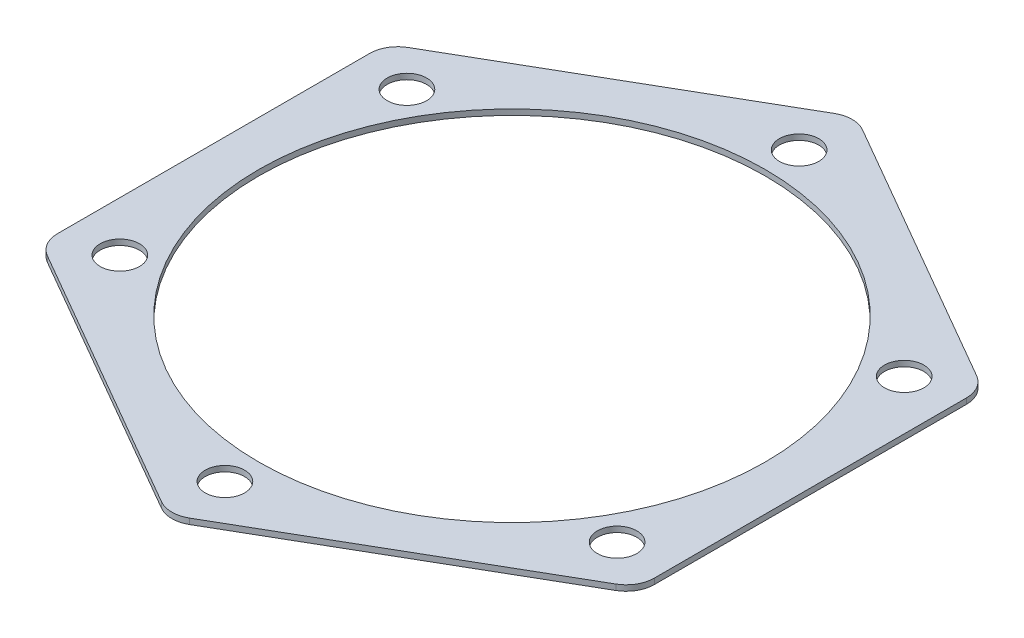
ISO-10303-21;
HEADER;
FILE_DESCRIPTION(('STEP AP214'),'2;1');
FILE_NAME('part.step','',(''),(''),'','','');
FILE_SCHEMA(('AUTOMOTIVE_DESIGN { 1 0 10303 214 1 1 1 1 }'));
ENDSEC;
DATA;
#1=APPLICATION_CONTEXT('core data for automotive mechanical design processes');
#2=APPLICATION_PROTOCOL_DEFINITION('international standard','automotive_design',2000,#1);
#3=PRODUCT_CONTEXT('',#1,'mechanical');
#4=PRODUCT('Part','Part','',(#3));
#5=PRODUCT_RELATED_PRODUCT_CATEGORY('part','',(#4));
#6=PRODUCT_DEFINITION_FORMATION('','',#4);
#7=PRODUCT_DEFINITION_CONTEXT('part definition',#1,'design');
#8=PRODUCT_DEFINITION('design','',#6,#7);
#9=PRODUCT_DEFINITION_SHAPE('','',#8);
#10=(LENGTH_UNIT() NAMED_UNIT(*) SI_UNIT(.MILLI.,.METRE.));
#11=(NAMED_UNIT(*) PLANE_ANGLE_UNIT() SI_UNIT($,.RADIAN.));
#12=(NAMED_UNIT(*) SI_UNIT($,.STERADIAN.) SOLID_ANGLE_UNIT());
#13=UNCERTAINTY_MEASURE_WITH_UNIT(LENGTH_MEASURE(1.E-05),#10,'distance_accuracy_value','');
#14=(GEOMETRIC_REPRESENTATION_CONTEXT(3) GLOBAL_UNCERTAINTY_ASSIGNED_CONTEXT((#13)) GLOBAL_UNIT_ASSIGNED_CONTEXT((#10,
#11,#12)) REPRESENTATION_CONTEXT('',''));
#15=CARTESIAN_POINT('',(0.,0.,0.));
#16=DIRECTION('',(0.,0.,1.));
#17=DIRECTION('',(1.,0.,0.));
#18=AXIS2_PLACEMENT_3D('',#15,#16,#17);
#19=CARTESIAN_POINT('',(-48.,1.,-27.712812921102));
#20=DIRECTION('',(0.,1.,0.));
#21=DIRECTION('',(0.,0.,1.));
#22=AXIS2_PLACEMENT_3D('',#19,#20,#21);
#23=PLANE('',#22);
#24=CARTESIAN_POINT('',(-44.1672955930031,1.,25.5000000000019));
#25=DIRECTION('',(0.,1.,0.));
#26=DIRECTION('',(0.,0.,1.));
#27=AXIS2_PLACEMENT_3D('',#24,#25,#26);
#28=CIRCLE('',#27,3.50000000000413);
#29=CARTESIAN_POINT('',(-44.1672955930031,1.,29.000000000006));
#30=VERTEX_POINT('',#29);
#31=EDGE_CURVE('E313',#30,#30,#28,.T.);
#32=ORIENTED_EDGE('',*,*,#31,.F.);
#33=EDGE_LOOP('',(#32));
#34=FACE_BOUND('',#33,.T.);
#35=CARTESIAN_POINT('',(44.1672955930096,1.,25.4999999999981));
#36=DIRECTION('',(0.,1.,0.));
#37=DIRECTION('',(0.,0.,1.));
#38=AXIS2_PLACEMENT_3D('',#35,#36,#37);
#39=CIRCLE('',#38,3.50000000000279);
#40=CARTESIAN_POINT('',(44.1672955930096,1.,29.0000000000009));
#41=VERTEX_POINT('',#40);
#42=EDGE_CURVE('E325',#41,#41,#39,.T.);
#43=ORIENTED_EDGE('',*,*,#42,.F.);
#44=EDGE_LOOP('',(#43));
#45=FACE_BOUND('',#44,.T.);
#46=CARTESIAN_POINT('',(0.,1.,-51.));
#47=DIRECTION('',(0.,1.,0.));
#48=DIRECTION('',(0.,0.,1.));
#49=AXIS2_PLACEMENT_3D('',#46,#47,#48);
#50=CIRCLE('',#49,3.5);
#51=CARTESIAN_POINT('',(0.,1.,-47.5));
#52=VERTEX_POINT('',#51);
#53=EDGE_CURVE('E337',#52,#52,#50,.T.);
#54=ORIENTED_EDGE('',*,*,#53,.F.);
#55=EDGE_LOOP('',(#54));
#56=FACE_BOUND('',#55,.T.);
#57=CARTESIAN_POINT('',(-48.,1.,-27.712812921102));
#58=DIRECTION('',(0.,1.,0.));
#59=DIRECTION('',(0.,0.,1.));
#60=AXIS2_PLACEMENT_3D('',#57,#58,#59);
#61=CIRCLE('',#60,5.);
#62=CARTESIAN_POINT('',(-50.5,1.,-32.0429399400242));
#63=VERTEX_POINT('',#62);
#64=CARTESIAN_POINT('',(-53.,1.,-27.712812921102));
#65=VERTEX_POINT('',#64);
#66=EDGE_CURVE('E187',#63,#65,#61,.T.);
#67=ORIENTED_EDGE('',*,*,#66,.T.);
#68=DIRECTION('',(0.,0.,1.));
#69=VECTOR('',#68,1.);
#70=CARTESIAN_POINT('',(-53.,1.,-27.712812921102));
#71=LINE('',#70,#69);
#72=CARTESIAN_POINT('',(-53.,1.,27.712812921102));
#73=VERTEX_POINT('',#72);
#74=EDGE_CURVE('E115',#65,#73,#71,.T.);
#75=ORIENTED_EDGE('',*,*,#74,.T.);
#76=CARTESIAN_POINT('',(-48.,1.,27.712812921102));
#77=DIRECTION('',(0.,1.,0.));
#78=DIRECTION('',(0.,0.,-1.));
#79=AXIS2_PLACEMENT_3D('',#76,#77,#78);
#80=CIRCLE('',#79,5.);
#81=CARTESIAN_POINT('',(-50.5,1.,32.0429399400242));
#82=VERTEX_POINT('',#81);
#83=EDGE_CURVE('E214',#73,#82,#80,.T.);
#84=ORIENTED_EDGE('',*,*,#83,.T.);
#85=DIRECTION('',(0.866025403784438,0.,0.5));
#86=VECTOR('',#85,1.);
#87=CARTESIAN_POINT('',(-50.5,1.,32.0429399400242));
#88=LINE('',#87,#86);
#89=CARTESIAN_POINT('',(-2.50000000000004,1.,59.7557528611262));
#90=VERTEX_POINT('',#89);
#91=EDGE_CURVE('E233',#82,#90,#88,.T.);
#92=ORIENTED_EDGE('',*,*,#91,.T.);
#93=CARTESIAN_POINT('',(0.,1.,55.4256258422041));
#94=DIRECTION('',(0.,1.,0.));
#95=DIRECTION('',(0.,0.,1.));
#96=AXIS2_PLACEMENT_3D('',#93,#94,#95);
#97=CIRCLE('',#96,5.);
#98=CARTESIAN_POINT('',(2.5,1.,59.7557528611262));
#99=VERTEX_POINT('',#98);
#100=EDGE_CURVE('E230',#90,#99,#97,.T.);
#101=ORIENTED_EDGE('',*,*,#100,.T.);
#102=DIRECTION('',(0.866025403784439,0.,-0.5));
#103=VECTOR('',#102,1.);
#104=CARTESIAN_POINT('',(2.5,1.,59.7557528611262));
#105=LINE('',#104,#103);
#106=CARTESIAN_POINT('',(50.5,1.,32.0429399400242));
#107=VERTEX_POINT('',#106);
#108=EDGE_CURVE('E232',#99,#107,#105,.T.);
#109=ORIENTED_EDGE('',*,*,#108,.T.);
#110=CARTESIAN_POINT('',(48.,1.,27.712812921102));
#111=DIRECTION('',(0.,1.,0.));
#112=DIRECTION('',(0.,0.,1.));
#113=AXIS2_PLACEMENT_3D('',#110,#111,#112);
#114=CIRCLE('',#113,5.);
#115=CARTESIAN_POINT('',(53.,1.,27.712812921102));
#116=VERTEX_POINT('',#115);
#117=EDGE_CURVE('E235',#107,#116,#114,.T.);
#118=ORIENTED_EDGE('',*,*,#117,.T.);
#119=DIRECTION('',(0.,0.,-1.));
#120=VECTOR('',#119,1.);
#121=CARTESIAN_POINT('',(53.,1.,27.712812921102));
#122=LINE('',#121,#120);
#123=CARTESIAN_POINT('',(53.,1.,-27.712812921102));
#124=VERTEX_POINT('',#123);
#125=EDGE_CURVE('E241',#116,#124,#122,.T.);
#126=ORIENTED_EDGE('',*,*,#125,.T.);
#127=CARTESIAN_POINT('',(48.,1.,-27.7128129211021));
#128=DIRECTION('',(0.,1.,0.));
#129=DIRECTION('',(0.,0.,1.));
#130=AXIS2_PLACEMENT_3D('',#127,#128,#129);
#131=CIRCLE('',#130,5.);
#132=CARTESIAN_POINT('',(50.5,1.,-32.0429399400243));
#133=VERTEX_POINT('',#132);
#134=EDGE_CURVE('E146',#124,#133,#131,.T.);
#135=ORIENTED_EDGE('',*,*,#134,.T.);
#136=DIRECTION('',(-0.866025403784439,0.,-0.5));
#137=VECTOR('',#136,1.);
#138=CARTESIAN_POINT('',(50.5,1.,-32.0429399400243));
#139=LINE('',#138,#137);
#140=CARTESIAN_POINT('',(2.50000000000002,1.,-59.7557528611263));
#141=VERTEX_POINT('',#140);
#142=EDGE_CURVE('E140',#133,#141,#139,.T.);
#143=ORIENTED_EDGE('',*,*,#142,.T.);
#144=CARTESIAN_POINT('',(0.,1.,-55.4256258422041));
#145=DIRECTION('',(0.,1.,0.));
#146=DIRECTION('',(0.,0.,1.));
#147=AXIS2_PLACEMENT_3D('',#144,#145,#146);
#148=CIRCLE('',#147,5.);
#149=CARTESIAN_POINT('',(-2.50000000000002,1.,-59.7557528611263));
#150=VERTEX_POINT('',#149);
#151=EDGE_CURVE('E144',#141,#150,#148,.T.);
#152=ORIENTED_EDGE('',*,*,#151,.T.);
#153=DIRECTION('',(-0.866025403784439,0.,0.5));
#154=VECTOR('',#153,1.);
#155=CARTESIAN_POINT('',(-2.50000000000002,1.,-59.7557528611263));
#156=LINE('',#155,#154);
#157=EDGE_CURVE('E60',#150,#63,#156,.T.);
#158=ORIENTED_EDGE('',*,*,#157,.T.);
#159=EDGE_LOOP('',(#67,#75,#84,#92,#101,#109,#118,#126,#135,#143,#152,#158));
#160=FACE_BOUND('',#159,.T.);
#161=CARTESIAN_POINT('',(0.,1.,0.));
#162=DIRECTION('',(0.,1.,0.));
#163=DIRECTION('',(0.,0.,1.));
#164=AXIS2_PLACEMENT_3D('',#161,#162,#163);
#165=CIRCLE('',#164,45.);
#166=CARTESIAN_POINT('',(0.,1.,45.));
#167=VERTEX_POINT('',#166);
#168=EDGE_CURVE('E168',#167,#167,#165,.T.);
#169=ORIENTED_EDGE('',*,*,#168,.F.);
#170=EDGE_LOOP('',(#169));
#171=FACE_BOUND('',#170,.T.);
#172=CARTESIAN_POINT('',(44.1672955930074,1.,-25.5000000000019));
#173=DIRECTION('',(0.,1.,0.));
#174=DIRECTION('',(0.,0.,1.));
#175=AXIS2_PLACEMENT_3D('',#172,#173,#174);
#176=CIRCLE('',#175,3.50000000000063);
#177=CARTESIAN_POINT('',(44.1672955930074,1.,-22.0000000000013));
#178=VERTEX_POINT('',#177);
#179=EDGE_CURVE('E331',#178,#178,#176,.T.);
#180=ORIENTED_EDGE('',*,*,#179,.F.);
#181=EDGE_LOOP('',(#180));
#182=FACE_BOUND('',#181,.T.);
#183=CARTESIAN_POINT('',(4.32978444682486E-12,1.,51.));
#184=DIRECTION('',(0.,1.,0.));
#185=DIRECTION('',(0.,0.,1.));
#186=AXIS2_PLACEMENT_3D('',#183,#184,#185);
#187=CIRCLE('',#186,3.50000000000448);
#188=CARTESIAN_POINT('',(4.32978444682486E-12,1.,54.5000000000045));
#189=VERTEX_POINT('',#188);
#190=EDGE_CURVE('E319',#189,#189,#187,.T.);
#191=ORIENTED_EDGE('',*,*,#190,.F.);
#192=EDGE_LOOP('',(#191));
#193=FACE_BOUND('',#192,.T.);
#194=CARTESIAN_POINT('',(-44.1672955930053,1.,-25.4999999999981));
#195=DIRECTION('',(0.,1.,0.));
#196=DIRECTION('',(0.,0.,1.));
#197=AXIS2_PLACEMENT_3D('',#194,#195,#196);
#198=CIRCLE('',#197,3.50000000000219);
#199=CARTESIAN_POINT('',(-44.1672955930053,1.,-21.9999999999959));
#200=VERTEX_POINT('',#199);
#201=EDGE_CURVE('E304',#200,#200,#198,.T.);
#202=ORIENTED_EDGE('',*,*,#201,.F.);
#203=EDGE_LOOP('',(#202));
#204=FACE_BOUND('',#203,.T.);
#205=ADVANCED_FACE('F43',(#34,#45,#56,#160,#171,#182,#193,#204),#23,.T.);
#206=CARTESIAN_POINT('',(-48.,0.,-27.712812921102));
#207=DIRECTION('',(0.,1.,0.));
#208=DIRECTION('',(0.,0.,1.));
#209=AXIS2_PLACEMENT_3D('',#206,#207,#208);
#210=PLANE('',#209);
#211=CARTESIAN_POINT('',(-48.,0.,-27.712812921102));
#212=DIRECTION('',(0.,1.,0.));
#213=DIRECTION('',(0.,0.,1.));
#214=AXIS2_PLACEMENT_3D('',#211,#212,#213);
#215=CIRCLE('',#214,5.);
#216=CARTESIAN_POINT('',(-50.5,0.,-32.0429399400242));
#217=VERTEX_POINT('',#216);
#218=CARTESIAN_POINT('',(-53.,0.,-27.712812921102));
#219=VERTEX_POINT('',#218);
#220=EDGE_CURVE('E164',#217,#219,#215,.T.);
#221=ORIENTED_EDGE('',*,*,#220,.F.);
#222=DIRECTION('',(-0.866025403784439,0.,0.5));
#223=VECTOR('',#222,1.);
#224=CARTESIAN_POINT('',(-2.50000000000002,0.,-59.7557528611263));
#225=LINE('',#224,#223);
#226=CARTESIAN_POINT('',(-2.50000000000002,0.,-59.7557528611263));
#227=VERTEX_POINT('',#226);
#228=EDGE_CURVE('E107',#227,#217,#225,.T.);
#229=ORIENTED_EDGE('',*,*,#228,.F.);
#230=CARTESIAN_POINT('',(0.,0.,-55.4256258422041));
#231=DIRECTION('',(0.,1.,0.));
#232=DIRECTION('',(0.,0.,1.));
#233=AXIS2_PLACEMENT_3D('',#230,#231,#232);
#234=CIRCLE('',#233,5.);
#235=CARTESIAN_POINT('',(2.50000000000002,0.,-59.7557528611263));
#236=VERTEX_POINT('',#235);
#237=EDGE_CURVE('E101',#236,#227,#234,.T.);
#238=ORIENTED_EDGE('',*,*,#237,.F.);
#239=DIRECTION('',(-0.866025403784439,0.,-0.5));
#240=VECTOR('',#239,1.);
#241=CARTESIAN_POINT('',(50.5,0.,-32.0429399400243));
#242=LINE('',#241,#240);
#243=CARTESIAN_POINT('',(50.5,0.,-32.0429399400243));
#244=VERTEX_POINT('',#243);
#245=EDGE_CURVE('E154',#244,#236,#242,.T.);
#246=ORIENTED_EDGE('',*,*,#245,.F.);
#247=CARTESIAN_POINT('',(48.,0.,-27.7128129211021));
#248=DIRECTION('',(0.,1.,0.));
#249=DIRECTION('',(0.,0.,1.));
#250=AXIS2_PLACEMENT_3D('',#247,#248,#249);
#251=CIRCLE('',#250,5.);
#252=CARTESIAN_POINT('',(53.,0.,-27.712812921102));
#253=VERTEX_POINT('',#252);
#254=EDGE_CURVE('E182',#253,#244,#251,.T.);
#255=ORIENTED_EDGE('',*,*,#254,.F.);
#256=DIRECTION('',(0.,0.,-1.));
#257=VECTOR('',#256,1.);
#258=CARTESIAN_POINT('',(53.,0.,27.712812921102));
#259=LINE('',#258,#257);
#260=CARTESIAN_POINT('',(53.,0.,27.712812921102));
#261=VERTEX_POINT('',#260);
#262=EDGE_CURVE('E180',#261,#253,#259,.T.);
#263=ORIENTED_EDGE('',*,*,#262,.F.);
#264=CARTESIAN_POINT('',(48.,0.,27.712812921102));
#265=DIRECTION('',(0.,1.,0.));
#266=DIRECTION('',(0.,0.,1.));
#267=AXIS2_PLACEMENT_3D('',#264,#265,#266);
#268=CIRCLE('',#267,5.);
#269=CARTESIAN_POINT('',(50.5,0.,32.0429399400242));
#270=VERTEX_POINT('',#269);
#271=EDGE_CURVE('E178',#270,#261,#268,.T.);
#272=ORIENTED_EDGE('',*,*,#271,.F.);
#273=DIRECTION('',(0.866025403784439,0.,-0.5));
#274=VECTOR('',#273,1.);
#275=CARTESIAN_POINT('',(2.5,0.,59.7557528611262));
#276=LINE('',#275,#274);
#277=CARTESIAN_POINT('',(2.5,0.,59.7557528611262));
#278=VERTEX_POINT('',#277);
#279=EDGE_CURVE('E176',#278,#270,#276,.T.);
#280=ORIENTED_EDGE('',*,*,#279,.F.);
#281=CARTESIAN_POINT('',(0.,0.,55.4256258422041));
#282=DIRECTION('',(0.,1.,0.));
#283=DIRECTION('',(0.,0.,1.));
#284=AXIS2_PLACEMENT_3D('',#281,#282,#283);
#285=CIRCLE('',#284,5.);
#286=CARTESIAN_POINT('',(-2.50000000000004,0.,59.7557528611262));
#287=VERTEX_POINT('',#286);
#288=EDGE_CURVE('E174',#287,#278,#285,.T.);
#289=ORIENTED_EDGE('',*,*,#288,.F.);
#290=DIRECTION('',(0.866025403784438,0.,0.5));
#291=VECTOR('',#290,1.);
#292=CARTESIAN_POINT('',(-50.5,0.,32.0429399400242));
#293=LINE('',#292,#291);
#294=CARTESIAN_POINT('',(-50.5,0.,32.0429399400242));
#295=VERTEX_POINT('',#294);
#296=EDGE_CURVE('E172',#295,#287,#293,.T.);
#297=ORIENTED_EDGE('',*,*,#296,.F.);
#298=CARTESIAN_POINT('',(-48.,0.,27.712812921102));
#299=DIRECTION('',(0.,1.,0.));
#300=DIRECTION('',(0.,0.,-1.));
#301=AXIS2_PLACEMENT_3D('',#298,#299,#300);
#302=CIRCLE('',#301,5.);
#303=CARTESIAN_POINT('',(-53.,0.,27.712812921102));
#304=VERTEX_POINT('',#303);
#305=EDGE_CURVE('E170',#304,#295,#302,.T.);
#306=ORIENTED_EDGE('',*,*,#305,.F.);
#307=DIRECTION('',(0.,0.,1.));
#308=VECTOR('',#307,1.);
#309=CARTESIAN_POINT('',(-53.,0.,-27.712812921102));
#310=LINE('',#309,#308);
#311=EDGE_CURVE('E167',#219,#304,#310,.T.);
#312=ORIENTED_EDGE('',*,*,#311,.F.);
#313=EDGE_LOOP('',(#221,#229,#238,#246,#255,#263,#272,#280,#289,#297,#306,#312));
#314=FACE_BOUND('',#313,.T.);
#315=CARTESIAN_POINT('',(0.,0.,0.));
#316=DIRECTION('',(0.,1.,0.));
#317=DIRECTION('',(0.,0.,1.));
#318=AXIS2_PLACEMENT_3D('',#315,#316,#317);
#319=CIRCLE('',#318,45.);
#320=CARTESIAN_POINT('',(0.,0.,45.));
#321=VERTEX_POINT('',#320);
#322=EDGE_CURVE('E340',#321,#321,#319,.T.);
#323=ORIENTED_EDGE('',*,*,#322,.T.);
#324=EDGE_LOOP('',(#323));
#325=FACE_BOUND('',#324,.T.);
#326=CARTESIAN_POINT('',(0.,0.,-51.));
#327=DIRECTION('',(0.,1.,0.));
#328=DIRECTION('',(0.,0.,1.));
#329=AXIS2_PLACEMENT_3D('',#326,#327,#328);
#330=CIRCLE('',#329,3.5);
#331=CARTESIAN_POINT('',(0.,0.,-47.5));
#332=VERTEX_POINT('',#331);
#333=EDGE_CURVE('E334',#332,#332,#330,.T.);
#334=ORIENTED_EDGE('',*,*,#333,.T.);
#335=EDGE_LOOP('',(#334));
#336=FACE_BOUND('',#335,.T.);
#337=CARTESIAN_POINT('',(44.1672955930074,0.,-25.5000000000019));
#338=DIRECTION('',(0.,1.,0.));
#339=DIRECTION('',(0.,0.,1.));
#340=AXIS2_PLACEMENT_3D('',#337,#338,#339);
#341=CIRCLE('',#340,3.50000000000063);
#342=CARTESIAN_POINT('',(44.1672955930074,0.,-22.0000000000013));
#343=VERTEX_POINT('',#342);
#344=EDGE_CURVE('E328',#343,#343,#341,.T.);
#345=ORIENTED_EDGE('',*,*,#344,.T.);
#346=EDGE_LOOP('',(#345));
#347=FACE_BOUND('',#346,.T.);
#348=CARTESIAN_POINT('',(44.1672955930096,0.,25.4999999999981));
#349=DIRECTION('',(0.,1.,0.));
#350=DIRECTION('',(0.,0.,1.));
#351=AXIS2_PLACEMENT_3D('',#348,#349,#350);
#352=CIRCLE('',#351,3.50000000000279);
#353=CARTESIAN_POINT('',(44.1672955930096,0.,29.0000000000009));
#354=VERTEX_POINT('',#353);
#355=EDGE_CURVE('E322',#354,#354,#352,.T.);
#356=ORIENTED_EDGE('',*,*,#355,.T.);
#357=EDGE_LOOP('',(#356));
#358=FACE_BOUND('',#357,.T.);
#359=CARTESIAN_POINT('',(4.32978444682486E-12,0.,51.));
#360=DIRECTION('',(0.,1.,0.));
#361=DIRECTION('',(0.,0.,1.));
#362=AXIS2_PLACEMENT_3D('',#359,#360,#361);
#363=CIRCLE('',#362,3.50000000000448);
#364=CARTESIAN_POINT('',(4.32978444682486E-12,0.,54.5000000000045));
#365=VERTEX_POINT('',#364);
#366=EDGE_CURVE('E316',#365,#365,#363,.T.);
#367=ORIENTED_EDGE('',*,*,#366,.T.);
#368=EDGE_LOOP('',(#367));
#369=FACE_BOUND('',#368,.T.);
#370=CARTESIAN_POINT('',(-44.1672955930031,0.,25.5000000000019));
#371=DIRECTION('',(0.,1.,0.));
#372=DIRECTION('',(0.,0.,1.));
#373=AXIS2_PLACEMENT_3D('',#370,#371,#372);
#374=CIRCLE('',#373,3.50000000000413);
#375=CARTESIAN_POINT('',(-44.1672955930031,0.,29.000000000006));
#376=VERTEX_POINT('',#375);
#377=EDGE_CURVE('E310',#376,#376,#374,.T.);
#378=ORIENTED_EDGE('',*,*,#377,.T.);
#379=EDGE_LOOP('',(#378));
#380=FACE_BOUND('',#379,.T.);
#381=CARTESIAN_POINT('',(-44.1672955930053,0.,-25.4999999999981));
#382=DIRECTION('',(0.,1.,0.));
#383=DIRECTION('',(0.,0.,1.));
#384=AXIS2_PLACEMENT_3D('',#381,#382,#383);
#385=CIRCLE('',#384,3.50000000000219);
#386=CARTESIAN_POINT('',(-44.1672955930053,0.,-21.9999999999959));
#387=VERTEX_POINT('',#386);
#388=EDGE_CURVE('E307',#387,#387,#385,.T.);
#389=ORIENTED_EDGE('',*,*,#388,.T.);
#390=EDGE_LOOP('',(#389));
#391=FACE_BOUND('',#390,.T.);
#392=ADVANCED_FACE('F218',(#314,#325,#336,#347,#358,#369,#380,#391),#210,.F.);
#393=CARTESIAN_POINT('',(-48.,1.,-27.712812921102));
#394=DIRECTION('',(0.,-1.,0.));
#395=DIRECTION('',(0.,0.,-1.));
#396=AXIS2_PLACEMENT_3D('',#393,#394,#395);
#397=CYLINDRICAL_SURFACE('',#396,5.);
#398=ORIENTED_EDGE('',*,*,#220,.T.);
#399=DIRECTION('',(0.,-1.,0.));
#400=VECTOR('',#399,1.);
#401=CARTESIAN_POINT('',(-53.,1.,-27.712812921102));
#402=LINE('',#401,#400);
#403=EDGE_CURVE('E11',#65,#219,#402,.T.);
#404=ORIENTED_EDGE('',*,*,#403,.F.);
#405=ORIENTED_EDGE('',*,*,#66,.F.);
#406=DIRECTION('',(0.,-1.,0.));
#407=VECTOR('',#406,1.);
#408=CARTESIAN_POINT('',(-50.5,1.,-32.0429399400242));
#409=LINE('',#408,#407);
#410=EDGE_CURVE('E160',#63,#217,#409,.T.);
#411=ORIENTED_EDGE('',*,*,#410,.T.);
#412=EDGE_LOOP('',(#398,#404,#405,#411));
#413=FACE_BOUND('',#412,.T.);
#414=ADVANCED_FACE('F45',(#413),#397,.T.);
#415=CARTESIAN_POINT('',(-53.,1.,-27.712812921102));
#416=DIRECTION('',(1.,0.,0.));
#417=DIRECTION('',(0.,0.,-1.));
#418=AXIS2_PLACEMENT_3D('',#415,#416,#417);
#419=PLANE('',#418);
#420=ORIENTED_EDGE('',*,*,#311,.T.);
#421=DIRECTION('',(0.,-1.,0.));
#422=VECTOR('',#421,1.);
#423=CARTESIAN_POINT('',(-53.,1.,27.712812921102));
#424=LINE('',#423,#422);
#425=EDGE_CURVE('E52',#73,#304,#424,.T.);
#426=ORIENTED_EDGE('',*,*,#425,.F.);
#427=ORIENTED_EDGE('',*,*,#74,.F.);
#428=ORIENTED_EDGE('',*,*,#403,.T.);
#429=EDGE_LOOP('',(#420,#426,#427,#428));
#430=FACE_BOUND('',#429,.T.);
#431=ADVANCED_FACE('F484',(#430),#419,.F.);
#432=CARTESIAN_POINT('',(-48.,1.,27.712812921102));
#433=DIRECTION('',(0.,-1.,0.));
#434=DIRECTION('',(0.,0.,-1.));
#435=AXIS2_PLACEMENT_3D('',#432,#433,#434);
#436=CYLINDRICAL_SURFACE('',#435,5.);
#437=ORIENTED_EDGE('',*,*,#305,.T.);
#438=DIRECTION('',(0.,-1.,0.));
#439=VECTOR('',#438,1.);
#440=CARTESIAN_POINT('',(-50.5,1.,32.0429399400242));
#441=LINE('',#440,#439);
#442=EDGE_CURVE('E206',#82,#295,#441,.T.);
#443=ORIENTED_EDGE('',*,*,#442,.F.);
#444=ORIENTED_EDGE('',*,*,#83,.F.);
#445=ORIENTED_EDGE('',*,*,#425,.T.);
#446=EDGE_LOOP('',(#437,#443,#444,#445));
#447=FACE_BOUND('',#446,.T.);
#448=ADVANCED_FACE('F212',(#447),#436,.T.);
#449=CARTESIAN_POINT('',(-50.5,1.,32.0429399400242));
#450=DIRECTION('',(0.5,0.,-0.866025403784439));
#451=DIRECTION('',(-0.866025403784439,0.,-0.5));
#452=AXIS2_PLACEMENT_3D('',#449,#450,#451);
#453=PLANE('',#452);
#454=ORIENTED_EDGE('',*,*,#296,.T.);
#455=DIRECTION('',(0.,-1.,0.));
#456=VECTOR('',#455,1.);
#457=CARTESIAN_POINT('',(-2.50000000000004,1.,59.7557528611262));
#458=LINE('',#457,#456);
#459=EDGE_CURVE('E203',#90,#287,#458,.T.);
#460=ORIENTED_EDGE('',*,*,#459,.F.);
#461=ORIENTED_EDGE('',*,*,#91,.F.);
#462=ORIENTED_EDGE('',*,*,#442,.T.);
#463=EDGE_LOOP('',(#454,#460,#461,#462));
#464=FACE_BOUND('',#463,.T.);
#465=ADVANCED_FACE('F224',(#464),#453,.F.);
#466=CARTESIAN_POINT('',(0.,1.,55.4256258422041));
#467=DIRECTION('',(0.,-1.,0.));
#468=DIRECTION('',(0.,0.,-1.));
#469=AXIS2_PLACEMENT_3D('',#466,#467,#468);
#470=CYLINDRICAL_SURFACE('',#469,5.);
#471=ORIENTED_EDGE('',*,*,#288,.T.);
#472=DIRECTION('',(0.,-1.,0.));
#473=VECTOR('',#472,1.);
#474=CARTESIAN_POINT('',(2.5,1.,59.7557528611262));
#475=LINE('',#474,#473);
#476=EDGE_CURVE('E200',#99,#278,#475,.T.);
#477=ORIENTED_EDGE('',*,*,#476,.F.);
#478=ORIENTED_EDGE('',*,*,#100,.F.);
#479=ORIENTED_EDGE('',*,*,#459,.T.);
#480=EDGE_LOOP('',(#471,#477,#478,#479));
#481=FACE_BOUND('',#480,.T.);
#482=ADVANCED_FACE('F228',(#481),#470,.T.);
#483=CARTESIAN_POINT('',(2.5,1.,59.7557528611262));
#484=DIRECTION('',(-0.5,0.,-0.866025403784439));
#485=DIRECTION('',(-0.866025403784439,0.,0.5));
#486=AXIS2_PLACEMENT_3D('',#483,#484,#485);
#487=PLANE('',#486);
#488=ORIENTED_EDGE('',*,*,#279,.T.);
#489=DIRECTION('',(0.,-1.,0.));
#490=VECTOR('',#489,1.);
#491=CARTESIAN_POINT('',(50.5,1.,32.0429399400242));
#492=LINE('',#491,#490);
#493=EDGE_CURVE('E197',#107,#270,#492,.T.);
#494=ORIENTED_EDGE('',*,*,#493,.F.);
#495=ORIENTED_EDGE('',*,*,#108,.F.);
#496=ORIENTED_EDGE('',*,*,#476,.T.);
#497=EDGE_LOOP('',(#488,#494,#495,#496));
#498=FACE_BOUND('',#497,.T.);
#499=ADVANCED_FACE('F449',(#498),#487,.F.);
#500=CARTESIAN_POINT('',(48.,1.,27.712812921102));
#501=DIRECTION('',(0.,-1.,0.));
#502=DIRECTION('',(0.,0.,-1.));
#503=AXIS2_PLACEMENT_3D('',#500,#501,#502);
#504=CYLINDRICAL_SURFACE('',#503,5.);
#505=ORIENTED_EDGE('',*,*,#271,.T.);
#506=DIRECTION('',(0.,-1.,0.));
#507=VECTOR('',#506,1.);
#508=CARTESIAN_POINT('',(53.,1.,27.712812921102));
#509=LINE('',#508,#507);
#510=EDGE_CURVE('E194',#116,#261,#509,.T.);
#511=ORIENTED_EDGE('',*,*,#510,.F.);
#512=ORIENTED_EDGE('',*,*,#117,.F.);
#513=ORIENTED_EDGE('',*,*,#493,.T.);
#514=EDGE_LOOP('',(#505,#511,#512,#513));
#515=FACE_BOUND('',#514,.T.);
#516=ADVANCED_FACE('F440',(#515),#504,.T.);
#517=CARTESIAN_POINT('',(53.,1.,27.712812921102));
#518=DIRECTION('',(-1.,0.,0.));
#519=DIRECTION('',(0.,0.,1.));
#520=AXIS2_PLACEMENT_3D('',#517,#518,#519);
#521=PLANE('',#520);
#522=ORIENTED_EDGE('',*,*,#262,.T.);
#523=DIRECTION('',(0.,-1.,0.));
#524=VECTOR('',#523,1.);
#525=CARTESIAN_POINT('',(53.,1.,-27.712812921102));
#526=LINE('',#525,#524);
#527=EDGE_CURVE('E191',#124,#253,#526,.T.);
#528=ORIENTED_EDGE('',*,*,#527,.F.);
#529=ORIENTED_EDGE('',*,*,#125,.F.);
#530=ORIENTED_EDGE('',*,*,#510,.T.);
#531=EDGE_LOOP('',(#522,#528,#529,#530));
#532=FACE_BOUND('',#531,.T.);
#533=ADVANCED_FACE('F247',(#532),#521,.F.);
#534=CARTESIAN_POINT('',(48.,1.,-27.7128129211021));
#535=DIRECTION('',(0.,-1.,0.));
#536=DIRECTION('',(0.,0.,-1.));
#537=AXIS2_PLACEMENT_3D('',#534,#535,#536);
#538=CYLINDRICAL_SURFACE('',#537,5.);
#539=ORIENTED_EDGE('',*,*,#254,.T.);
#540=DIRECTION('',(0.,-1.,0.));
#541=VECTOR('',#540,1.);
#542=CARTESIAN_POINT('',(50.5,1.,-32.0429399400243));
#543=LINE('',#542,#541);
#544=EDGE_CURVE('E155',#133,#244,#543,.T.);
#545=ORIENTED_EDGE('',*,*,#544,.F.);
#546=ORIENTED_EDGE('',*,*,#134,.F.);
#547=ORIENTED_EDGE('',*,*,#527,.T.);
#548=EDGE_LOOP('',(#539,#545,#546,#547));
#549=FACE_BOUND('',#548,.T.);
#550=ADVANCED_FACE('F251',(#549),#538,.T.);
#551=CARTESIAN_POINT('',(50.5,1.,-32.0429399400243));
#552=DIRECTION('',(-0.5,0.,0.866025403784439));
#553=DIRECTION('',(0.866025403784439,0.,0.5));
#554=AXIS2_PLACEMENT_3D('',#551,#552,#553);
#555=PLANE('',#554);
#556=ORIENTED_EDGE('',*,*,#245,.T.);
#557=DIRECTION('',(0.,-1.,0.));
#558=VECTOR('',#557,1.);
#559=CARTESIAN_POINT('',(2.50000000000002,1.,-59.7557528611263));
#560=LINE('',#559,#558);
#561=EDGE_CURVE('E151',#141,#236,#560,.T.);
#562=ORIENTED_EDGE('',*,*,#561,.F.);
#563=ORIENTED_EDGE('',*,*,#142,.F.);
#564=ORIENTED_EDGE('',*,*,#544,.T.);
#565=EDGE_LOOP('',(#556,#562,#563,#564));
#566=FACE_BOUND('',#565,.T.);
#567=ADVANCED_FACE('F152',(#566),#555,.F.);
#568=CARTESIAN_POINT('',(0.,1.,-55.4256258422041));
#569=DIRECTION('',(0.,-1.,0.));
#570=DIRECTION('',(0.,0.,-1.));
#571=AXIS2_PLACEMENT_3D('',#568,#569,#570);
#572=CYLINDRICAL_SURFACE('',#571,5.);
#573=ORIENTED_EDGE('',*,*,#237,.T.);
#574=DIRECTION('',(0.,-1.,0.));
#575=VECTOR('',#574,1.);
#576=CARTESIAN_POINT('',(-2.50000000000002,1.,-59.7557528611263));
#577=LINE('',#576,#575);
#578=EDGE_CURVE('E156',#150,#227,#577,.T.);
#579=ORIENTED_EDGE('',*,*,#578,.F.);
#580=ORIENTED_EDGE('',*,*,#151,.F.);
#581=ORIENTED_EDGE('',*,*,#561,.T.);
#582=EDGE_LOOP('',(#573,#579,#580,#581));
#583=FACE_BOUND('',#582,.T.);
#584=ADVANCED_FACE('F158',(#583),#572,.T.);
#585=CARTESIAN_POINT('',(-2.50000000000002,1.,-59.7557528611263));
#586=DIRECTION('',(0.5,0.,0.866025403784439));
#587=DIRECTION('',(0.866025403784439,0.,-0.5));
#588=AXIS2_PLACEMENT_3D('',#585,#586,#587);
#589=PLANE('',#588);
#590=ORIENTED_EDGE('',*,*,#228,.T.);
#591=ORIENTED_EDGE('',*,*,#410,.F.);
#592=ORIENTED_EDGE('',*,*,#157,.F.);
#593=ORIENTED_EDGE('',*,*,#578,.T.);
#594=EDGE_LOOP('',(#590,#591,#592,#593));
#595=FACE_BOUND('',#594,.T.);
#596=ADVANCED_FACE('F255',(#595),#589,.F.);
#597=CARTESIAN_POINT('',(0.,1.,0.));
#598=DIRECTION('',(0.,-1.,0.));
#599=DIRECTION('',(0.,0.,-1.));
#600=AXIS2_PLACEMENT_3D('',#597,#598,#599);
#601=CYLINDRICAL_SURFACE('',#600,45.);
#602=ORIENTED_EDGE('',*,*,#168,.T.);
#603=EDGE_LOOP('',(#602));
#604=FACE_BOUND('',#603,.T.);
#605=ORIENTED_EDGE('',*,*,#322,.F.);
#606=EDGE_LOOP('',(#605));
#607=FACE_BOUND('',#606,.T.);
#608=ADVANCED_FACE('F257',(#604,#607),#601,.F.);
#609=CARTESIAN_POINT('',(0.,1.,-51.));
#610=DIRECTION('',(0.,-1.,0.));
#611=DIRECTION('',(0.,0.,-1.));
#612=AXIS2_PLACEMENT_3D('',#609,#610,#611);
#613=CYLINDRICAL_SURFACE('',#612,3.5);
#614=ORIENTED_EDGE('',*,*,#53,.T.);
#615=EDGE_LOOP('',(#614));
#616=FACE_BOUND('',#615,.T.);
#617=ORIENTED_EDGE('',*,*,#333,.F.);
#618=EDGE_LOOP('',(#617));
#619=FACE_BOUND('',#618,.T.);
#620=ADVANCED_FACE('F263',(#616,#619),#613,.F.);
#621=CARTESIAN_POINT('',(44.1672955930074,1.,-25.5000000000019));
#622=DIRECTION('',(0.,-1.,0.));
#623=DIRECTION('',(0.,0.,-1.));
#624=AXIS2_PLACEMENT_3D('',#621,#622,#623);
#625=CYLINDRICAL_SURFACE('',#624,3.50000000000063);
#626=ORIENTED_EDGE('',*,*,#179,.T.);
#627=EDGE_LOOP('',(#626));
#628=FACE_BOUND('',#627,.T.);
#629=ORIENTED_EDGE('',*,*,#344,.F.);
#630=EDGE_LOOP('',(#629));
#631=FACE_BOUND('',#630,.T.);
#632=ADVANCED_FACE('F279',(#628,#631),#625,.F.);
#633=CARTESIAN_POINT('',(44.1672955930096,1.,25.4999999999981));
#634=DIRECTION('',(0.,-1.,0.));
#635=DIRECTION('',(0.,0.,-1.));
#636=AXIS2_PLACEMENT_3D('',#633,#634,#635);
#637=CYLINDRICAL_SURFACE('',#636,3.50000000000279);
#638=ORIENTED_EDGE('',*,*,#42,.T.);
#639=EDGE_LOOP('',(#638));
#640=FACE_BOUND('',#639,.T.);
#641=ORIENTED_EDGE('',*,*,#355,.F.);
#642=EDGE_LOOP('',(#641));
#643=FACE_BOUND('',#642,.T.);
#644=ADVANCED_FACE('F283',(#640,#643),#637,.F.);
#645=CARTESIAN_POINT('',(4.32978444682486E-12,1.,51.));
#646=DIRECTION('',(0.,-1.,0.));
#647=DIRECTION('',(0.,0.,-1.));
#648=AXIS2_PLACEMENT_3D('',#645,#646,#647);
#649=CYLINDRICAL_SURFACE('',#648,3.50000000000448);
#650=ORIENTED_EDGE('',*,*,#190,.T.);
#651=EDGE_LOOP('',(#650));
#652=FACE_BOUND('',#651,.T.);
#653=ORIENTED_EDGE('',*,*,#366,.F.);
#654=EDGE_LOOP('',(#653));
#655=FACE_BOUND('',#654,.T.);
#656=ADVANCED_FACE('F287',(#652,#655),#649,.F.);
#657=CARTESIAN_POINT('',(-44.1672955930031,1.,25.5000000000019));
#658=DIRECTION('',(0.,-1.,0.));
#659=DIRECTION('',(0.,0.,-1.));
#660=AXIS2_PLACEMENT_3D('',#657,#658,#659);
#661=CYLINDRICAL_SURFACE('',#660,3.50000000000413);
#662=ORIENTED_EDGE('',*,*,#31,.T.);
#663=EDGE_LOOP('',(#662));
#664=FACE_BOUND('',#663,.T.);
#665=ORIENTED_EDGE('',*,*,#377,.F.);
#666=EDGE_LOOP('',(#665));
#667=FACE_BOUND('',#666,.T.);
#668=ADVANCED_FACE('F291',(#664,#667),#661,.F.);
#669=CARTESIAN_POINT('',(-44.1672955930053,1.,-25.4999999999981));
#670=DIRECTION('',(0.,-1.,0.));
#671=DIRECTION('',(0.,0.,-1.));
#672=AXIS2_PLACEMENT_3D('',#669,#670,#671);
#673=CYLINDRICAL_SURFACE('',#672,3.50000000000219);
#674=ORIENTED_EDGE('',*,*,#201,.T.);
#675=EDGE_LOOP('',(#674));
#676=FACE_BOUND('',#675,.T.);
#677=ORIENTED_EDGE('',*,*,#388,.F.);
#678=EDGE_LOOP('',(#677));
#679=FACE_BOUND('',#678,.T.);
#680=ADVANCED_FACE('F295',(#676,#679),#673,.F.);
#681=CLOSED_SHELL('',(#205,#392,#414,#431,#448,#465,#482,#499,#516,#533,#550,#567,#584,#596,
#608,#620,#632,#644,#656,#668,#680));
#682=MANIFOLD_SOLID_BREP('B2',#681);
#683=ADVANCED_BREP_SHAPE_REPRESENTATION('',(#18,#682),#14);
#684=SHAPE_DEFINITION_REPRESENTATION(#9,#683);
ENDSEC;
END-ISO-10303-21;
